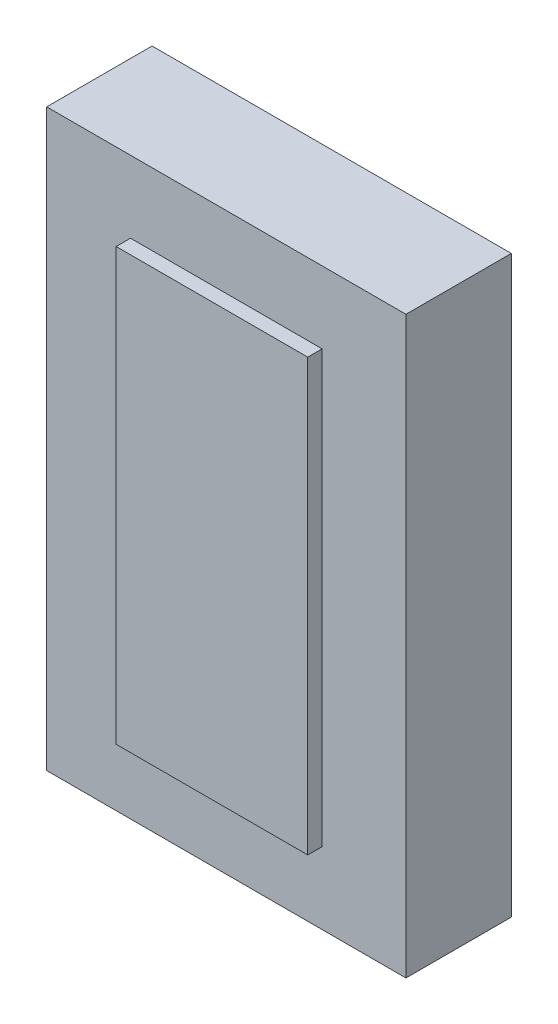
ISO-10303-21;
HEADER;
FILE_DESCRIPTION(('STEP AP214'),'2;1');
FILE_NAME('part.step','',(''),(''),'','','');
FILE_SCHEMA(('AUTOMOTIVE_DESIGN { 1 0 10303 214 1 1 1 1 }'));
ENDSEC;
DATA;
#1=APPLICATION_CONTEXT('core data for automotive mechanical design processes');
#2=APPLICATION_PROTOCOL_DEFINITION('international standard','automotive_design',2000,#1);
#3=PRODUCT_CONTEXT('',#1,'mechanical');
#4=PRODUCT('Part','Part','',(#3));
#5=PRODUCT_RELATED_PRODUCT_CATEGORY('part','',(#4));
#6=PRODUCT_DEFINITION_FORMATION('','',#4);
#7=PRODUCT_DEFINITION_CONTEXT('part definition',#1,'design');
#8=PRODUCT_DEFINITION('design','',#6,#7);
#9=PRODUCT_DEFINITION_SHAPE('','',#8);
#10=(LENGTH_UNIT() NAMED_UNIT(*) SI_UNIT(.MILLI.,.METRE.));
#11=(NAMED_UNIT(*) PLANE_ANGLE_UNIT() SI_UNIT($,.RADIAN.));
#12=(NAMED_UNIT(*) SI_UNIT($,.STERADIAN.) SOLID_ANGLE_UNIT());
#13=UNCERTAINTY_MEASURE_WITH_UNIT(LENGTH_MEASURE(1.E-05),#10,'distance_accuracy_value','');
#14=(GEOMETRIC_REPRESENTATION_CONTEXT(3) GLOBAL_UNCERTAINTY_ASSIGNED_CONTEXT((#13)) GLOBAL_UNIT_ASSIGNED_CONTEXT((#10,
#11,#12)) REPRESENTATION_CONTEXT('',''));
#15=CARTESIAN_POINT('',(0.,0.,0.));
#16=DIRECTION('',(0.,0.,1.));
#17=DIRECTION('',(1.,0.,0.));
#18=AXIS2_PLACEMENT_3D('',#15,#16,#17);
#19=CARTESIAN_POINT('',(0.,0.,22.));
#20=DIRECTION('',(0.,0.,1.));
#21=DIRECTION('',(1.,0.,0.));
#22=AXIS2_PLACEMENT_3D('',#19,#20,#21);
#23=PLANE('',#22);
#24=DIRECTION('',(0.,-1.,0.));
#25=VECTOR('',#24,1.);
#26=CARTESIAN_POINT('',(-37.5,60.,22.));
#27=LINE('',#26,#25);
#28=CARTESIAN_POINT('',(-37.5,60.,22.));
#29=VERTEX_POINT('',#28);
#30=CARTESIAN_POINT('',(-37.5,-60.,22.));
#31=VERTEX_POINT('',#30);
#32=EDGE_CURVE('E145',#29,#31,#27,.T.);
#33=ORIENTED_EDGE('',*,*,#32,.T.);
#34=DIRECTION('',(1.,0.,0.));
#35=VECTOR('',#34,1.);
#36=CARTESIAN_POINT('',(-37.5,-60.,22.));
#37=LINE('',#36,#35);
#38=CARTESIAN_POINT('',(37.5,-60.,22.));
#39=VERTEX_POINT('',#38);
#40=EDGE_CURVE('E85',#31,#39,#37,.T.);
#41=ORIENTED_EDGE('',*,*,#40,.T.);
#42=DIRECTION('',(0.,1.,0.));
#43=VECTOR('',#42,1.);
#44=CARTESIAN_POINT('',(37.5,60.,22.));
#45=LINE('',#44,#43);
#46=CARTESIAN_POINT('',(37.5,60.,22.));
#47=VERTEX_POINT('',#46);
#48=EDGE_CURVE('E148',#39,#47,#45,.T.);
#49=ORIENTED_EDGE('',*,*,#48,.T.);
#50=DIRECTION('',(-1.,0.,0.));
#51=VECTOR('',#50,1.);
#52=CARTESIAN_POINT('',(-37.5,60.,22.));
#53=LINE('',#52,#51);
#54=EDGE_CURVE('E57',#47,#29,#53,.T.);
#55=ORIENTED_EDGE('',*,*,#54,.T.);
#56=EDGE_LOOP('',(#33,#41,#49,#55));
#57=FACE_BOUND('',#56,.T.);
#58=DIRECTION('',(-1.,0.,0.));
#59=VECTOR('',#58,1.);
#60=CARTESIAN_POINT('',(0.,-45.,22.));
#61=LINE('',#60,#59);
#62=CARTESIAN_POINT('',(20.,-45.,22.));
#63=VERTEX_POINT('',#62);
#64=CARTESIAN_POINT('',(-20.,-45.,22.));
#65=VERTEX_POINT('',#64);
#66=EDGE_CURVE('E141',#63,#65,#61,.T.);
#67=ORIENTED_EDGE('',*,*,#66,.T.);
#68=DIRECTION('',(0.,1.,0.));
#69=VECTOR('',#68,1.);
#70=CARTESIAN_POINT('',(-20.,0.,22.));
#71=LINE('',#70,#69);
#72=CARTESIAN_POINT('',(-20.,45.,22.));
#73=VERTEX_POINT('',#72);
#74=EDGE_CURVE('E130',#65,#73,#71,.T.);
#75=ORIENTED_EDGE('',*,*,#74,.T.);
#76=DIRECTION('',(1.,0.,0.));
#77=VECTOR('',#76,1.);
#78=CARTESIAN_POINT('',(0.,45.,22.));
#79=LINE('',#78,#77);
#80=CARTESIAN_POINT('',(20.,45.,22.));
#81=VERTEX_POINT('',#80);
#82=EDGE_CURVE('E131',#73,#81,#79,.T.);
#83=ORIENTED_EDGE('',*,*,#82,.T.);
#84=DIRECTION('',(0.,-1.,0.));
#85=VECTOR('',#84,1.);
#86=CARTESIAN_POINT('',(20.,0.,22.));
#87=LINE('',#86,#85);
#88=EDGE_CURVE('E134',#81,#63,#87,.T.);
#89=ORIENTED_EDGE('',*,*,#88,.T.);
#90=EDGE_LOOP('',(#67,#75,#83,#89));
#91=FACE_BOUND('',#90,.T.);
#92=ADVANCED_FACE('F33',(#57,#91),#23,.T.);
#93=CARTESIAN_POINT('',(-37.5,60.,22.));
#94=DIRECTION('',(1.,0.,0.));
#95=DIRECTION('',(0.,0.,-1.));
#96=AXIS2_PLACEMENT_3D('',#93,#94,#95);
#97=PLANE('',#96);
#98=DIRECTION('',(0.,-1.,0.));
#99=VECTOR('',#98,1.);
#100=CARTESIAN_POINT('',(-37.5,60.,0.));
#101=LINE('',#100,#99);
#102=CARTESIAN_POINT('',(-37.5,60.,0.));
#103=VERTEX_POINT('',#102);
#104=CARTESIAN_POINT('',(-37.5,-60.,0.));
#105=VERTEX_POINT('',#104);
#106=EDGE_CURVE('E144',#103,#105,#101,.T.);
#107=ORIENTED_EDGE('',*,*,#106,.T.);
#108=DIRECTION('',(0.,0.,-1.));
#109=VECTOR('',#108,1.);
#110=CARTESIAN_POINT('',(-37.5,-60.,22.));
#111=LINE('',#110,#109);
#112=EDGE_CURVE('E11',#31,#105,#111,.T.);
#113=ORIENTED_EDGE('',*,*,#112,.F.);
#114=ORIENTED_EDGE('',*,*,#32,.F.);
#115=DIRECTION('',(0.,0.,-1.));
#116=VECTOR('',#115,1.);
#117=CARTESIAN_POINT('',(-37.5,60.,22.));
#118=LINE('',#117,#116);
#119=EDGE_CURVE('E151',#29,#103,#118,.T.);
#120=ORIENTED_EDGE('',*,*,#119,.T.);
#121=EDGE_LOOP('',(#107,#113,#114,#120));
#122=FACE_BOUND('',#121,.T.);
#123=ADVANCED_FACE('F35',(#122),#97,.F.);
#124=CARTESIAN_POINT('',(-37.5,-60.,22.));
#125=DIRECTION('',(0.,1.,0.));
#126=DIRECTION('',(-1.,0.,0.));
#127=AXIS2_PLACEMENT_3D('',#124,#125,#126);
#128=PLANE('',#127);
#129=DIRECTION('',(1.,0.,0.));
#130=VECTOR('',#129,1.);
#131=CARTESIAN_POINT('',(-37.5,-60.,0.));
#132=LINE('',#131,#130);
#133=CARTESIAN_POINT('',(37.5,-60.,0.));
#134=VERTEX_POINT('',#133);
#135=EDGE_CURVE('E154',#105,#134,#132,.T.);
#136=ORIENTED_EDGE('',*,*,#135,.T.);
#137=DIRECTION('',(0.,0.,-1.));
#138=VECTOR('',#137,1.);
#139=CARTESIAN_POINT('',(37.5,-60.,22.));
#140=LINE('',#139,#138);
#141=EDGE_CURVE('E41',#39,#134,#140,.T.);
#142=ORIENTED_EDGE('',*,*,#141,.F.);
#143=ORIENTED_EDGE('',*,*,#40,.F.);
#144=ORIENTED_EDGE('',*,*,#112,.T.);
#145=EDGE_LOOP('',(#136,#142,#143,#144));
#146=FACE_BOUND('',#145,.T.);
#147=ADVANCED_FACE('F181',(#146),#128,.F.);
#148=CARTESIAN_POINT('',(37.5,60.,22.));
#149=DIRECTION('',(-1.,0.,0.));
#150=DIRECTION('',(0.,0.,1.));
#151=AXIS2_PLACEMENT_3D('',#148,#149,#150);
#152=PLANE('',#151);
#153=DIRECTION('',(0.,1.,0.));
#154=VECTOR('',#153,1.);
#155=CARTESIAN_POINT('',(37.5,60.,0.));
#156=LINE('',#155,#154);
#157=CARTESIAN_POINT('',(37.5,60.,0.));
#158=VERTEX_POINT('',#157);
#159=EDGE_CURVE('E156',#134,#158,#156,.T.);
#160=ORIENTED_EDGE('',*,*,#159,.T.);
#161=DIRECTION('',(0.,0.,-1.));
#162=VECTOR('',#161,1.);
#163=CARTESIAN_POINT('',(37.5,60.,22.));
#164=LINE('',#163,#162);
#165=EDGE_CURVE('E160',#47,#158,#164,.T.);
#166=ORIENTED_EDGE('',*,*,#165,.F.);
#167=ORIENTED_EDGE('',*,*,#48,.F.);
#168=ORIENTED_EDGE('',*,*,#141,.T.);
#169=EDGE_LOOP('',(#160,#166,#167,#168));
#170=FACE_BOUND('',#169,.T.);
#171=ADVANCED_FACE('F165',(#170),#152,.F.);
#172=CARTESIAN_POINT('',(-37.5,60.,22.));
#173=DIRECTION('',(0.,-1.,0.));
#174=DIRECTION('',(1.,0.,0.));
#175=AXIS2_PLACEMENT_3D('',#172,#173,#174);
#176=PLANE('',#175);
#177=DIRECTION('',(-1.,0.,0.));
#178=VECTOR('',#177,1.);
#179=CARTESIAN_POINT('',(-37.5,60.,0.));
#180=LINE('',#179,#178);
#181=EDGE_CURVE('E78',#158,#103,#180,.T.);
#182=ORIENTED_EDGE('',*,*,#181,.T.);
#183=ORIENTED_EDGE('',*,*,#119,.F.);
#184=ORIENTED_EDGE('',*,*,#54,.F.);
#185=ORIENTED_EDGE('',*,*,#165,.T.);
#186=EDGE_LOOP('',(#182,#183,#184,#185));
#187=FACE_BOUND('',#186,.T.);
#188=ADVANCED_FACE('F173',(#187),#176,.F.);
#189=CARTESIAN_POINT('',(0.,0.,0.));
#190=DIRECTION('',(0.,0.,1.));
#191=DIRECTION('',(1.,0.,0.));
#192=AXIS2_PLACEMENT_3D('',#189,#190,#191);
#193=PLANE('',#192);
#194=ORIENTED_EDGE('',*,*,#106,.F.);
#195=ORIENTED_EDGE('',*,*,#181,.F.);
#196=ORIENTED_EDGE('',*,*,#159,.F.);
#197=ORIENTED_EDGE('',*,*,#135,.F.);
#198=EDGE_LOOP('',(#194,#195,#196,#197));
#199=FACE_BOUND('',#198,.T.);
#200=ADVANCED_FACE('F169',(#199),#193,.F.);
#201=CARTESIAN_POINT('',(-20.,45.,25.));
#202=DIRECTION('',(1.,0.,0.));
#203=DIRECTION('',(0.,0.,-1.));
#204=AXIS2_PLACEMENT_3D('',#201,#202,#203);
#205=PLANE('',#204);
#206=ORIENTED_EDGE('',*,*,#74,.F.);
#207=DIRECTION('',(0.,0.,-1.));
#208=VECTOR('',#207,1.);
#209=CARTESIAN_POINT('',(-20.,-45.,25.));
#210=LINE('',#209,#208);
#211=CARTESIAN_POINT('',(-20.,-45.,25.));
#212=VERTEX_POINT('',#211);
#213=EDGE_CURVE('E112',#212,#65,#210,.T.);
#214=ORIENTED_EDGE('',*,*,#213,.F.);
#215=DIRECTION('',(0.,-1.,0.));
#216=VECTOR('',#215,1.);
#217=CARTESIAN_POINT('',(-20.,45.,25.));
#218=LINE('',#217,#216);
#219=CARTESIAN_POINT('',(-20.,45.,25.));
#220=VERTEX_POINT('',#219);
#221=EDGE_CURVE('E119',#220,#212,#218,.T.);
#222=ORIENTED_EDGE('',*,*,#221,.F.);
#223=DIRECTION('',(0.,0.,-1.));
#224=VECTOR('',#223,1.);
#225=CARTESIAN_POINT('',(-20.,45.,25.));
#226=LINE('',#225,#224);
#227=EDGE_CURVE('E265',#220,#73,#226,.T.);
#228=ORIENTED_EDGE('',*,*,#227,.T.);
#229=EDGE_LOOP('',(#206,#214,#222,#228));
#230=FACE_BOUND('',#229,.T.);
#231=ADVANCED_FACE('F128',(#230),#205,.F.);
#232=CARTESIAN_POINT('',(-20.,-45.,25.));
#233=DIRECTION('',(0.,1.,0.));
#234=DIRECTION('',(0.,0.,1.));
#235=AXIS2_PLACEMENT_3D('',#232,#233,#234);
#236=PLANE('',#235);
#237=ORIENTED_EDGE('',*,*,#66,.F.);
#238=DIRECTION('',(0.,0.,-1.));
#239=VECTOR('',#238,1.);
#240=CARTESIAN_POINT('',(20.,-45.,25.));
#241=LINE('',#240,#239);
#242=CARTESIAN_POINT('',(20.,-45.,25.));
#243=VERTEX_POINT('',#242);
#244=EDGE_CURVE('E115',#243,#63,#241,.T.);
#245=ORIENTED_EDGE('',*,*,#244,.F.);
#246=DIRECTION('',(1.,0.,0.));
#247=VECTOR('',#246,1.);
#248=CARTESIAN_POINT('',(-20.,-45.,25.));
#249=LINE('',#248,#247);
#250=EDGE_CURVE('E108',#212,#243,#249,.T.);
#251=ORIENTED_EDGE('',*,*,#250,.F.);
#252=ORIENTED_EDGE('',*,*,#213,.T.);
#253=EDGE_LOOP('',(#237,#245,#251,#252));
#254=FACE_BOUND('',#253,.T.);
#255=ADVANCED_FACE('F110',(#254),#236,.F.);
#256=CARTESIAN_POINT('',(20.,45.,25.));
#257=DIRECTION('',(-1.,0.,0.));
#258=DIRECTION('',(0.,0.,1.));
#259=AXIS2_PLACEMENT_3D('',#256,#257,#258);
#260=PLANE('',#259);
#261=ORIENTED_EDGE('',*,*,#88,.F.);
#262=DIRECTION('',(0.,0.,-1.));
#263=VECTOR('',#262,1.);
#264=CARTESIAN_POINT('',(20.,45.,25.));
#265=LINE('',#264,#263);
#266=CARTESIAN_POINT('',(20.,45.,25.));
#267=VERTEX_POINT('',#266);
#268=EDGE_CURVE('E48',#267,#81,#265,.T.);
#269=ORIENTED_EDGE('',*,*,#268,.F.);
#270=DIRECTION('',(0.,1.,0.));
#271=VECTOR('',#270,1.);
#272=CARTESIAN_POINT('',(20.,45.,25.));
#273=LINE('',#272,#271);
#274=EDGE_CURVE('E118',#243,#267,#273,.T.);
#275=ORIENTED_EDGE('',*,*,#274,.F.);
#276=ORIENTED_EDGE('',*,*,#244,.T.);
#277=EDGE_LOOP('',(#261,#269,#275,#276));
#278=FACE_BOUND('',#277,.T.);
#279=ADVANCED_FACE('F194',(#278),#260,.F.);
#280=CARTESIAN_POINT('',(-20.,45.,25.));
#281=DIRECTION('',(0.,-1.,0.));
#282=DIRECTION('',(0.,0.,-1.));
#283=AXIS2_PLACEMENT_3D('',#280,#281,#282);
#284=PLANE('',#283);
#285=ORIENTED_EDGE('',*,*,#82,.F.);
#286=ORIENTED_EDGE('',*,*,#227,.F.);
#287=DIRECTION('',(-1.,0.,0.));
#288=VECTOR('',#287,1.);
#289=CARTESIAN_POINT('',(-20.,45.,25.));
#290=LINE('',#289,#288);
#291=EDGE_CURVE('E123',#267,#220,#290,.T.);
#292=ORIENTED_EDGE('',*,*,#291,.F.);
#293=ORIENTED_EDGE('',*,*,#268,.T.);
#294=EDGE_LOOP('',(#285,#286,#292,#293));
#295=FACE_BOUND('',#294,.T.);
#296=ADVANCED_FACE('F197',(#295),#284,.F.);
#297=CARTESIAN_POINT('',(0.,0.,25.));
#298=DIRECTION('',(0.,0.,1.));
#299=DIRECTION('',(1.,0.,0.));
#300=AXIS2_PLACEMENT_3D('',#297,#298,#299);
#301=PLANE('',#300);
#302=ORIENTED_EDGE('',*,*,#221,.T.);
#303=ORIENTED_EDGE('',*,*,#250,.T.);
#304=ORIENTED_EDGE('',*,*,#274,.T.);
#305=ORIENTED_EDGE('',*,*,#291,.T.);
#306=EDGE_LOOP('',(#302,#303,#304,#305));
#307=FACE_BOUND('',#306,.T.);
#308=ADVANCED_FACE('F122',(#307),#301,.T.);
#309=CLOSED_SHELL('',(#92,#123,#147,#171,#188,#200,#231,#255,#279,#296,#308));
#310=MANIFOLD_SOLID_BREP('B2',#309);
#311=ADVANCED_BREP_SHAPE_REPRESENTATION('',(#18,#310),#14);
#312=SHAPE_DEFINITION_REPRESENTATION(#9,#311);
ENDSEC;
END-ISO-10303-21;
